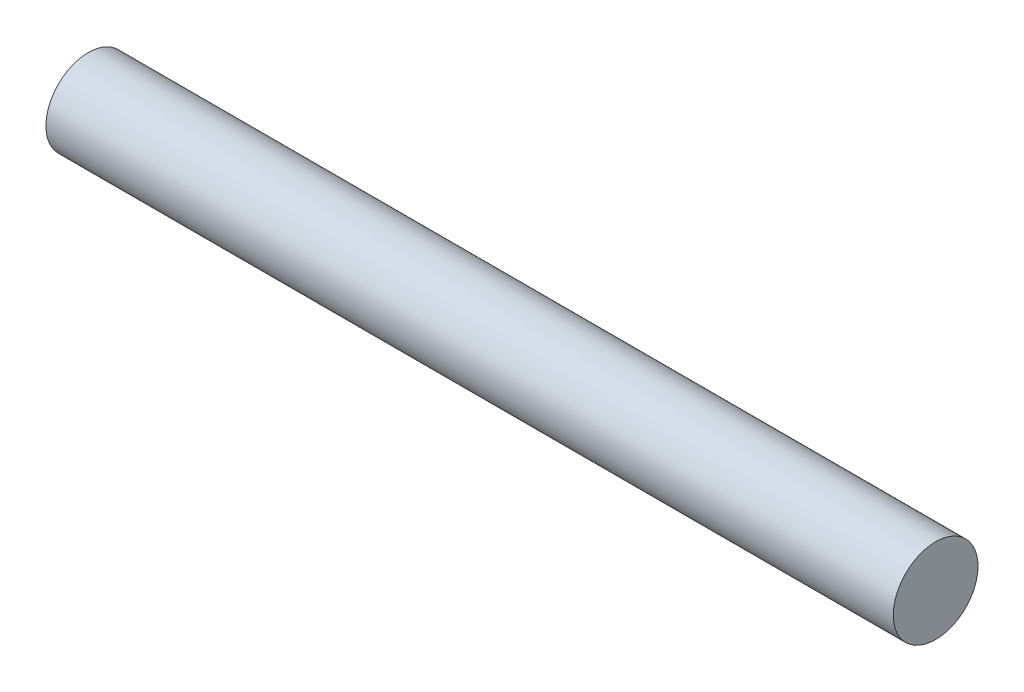
ISO-10303-21;
HEADER;
FILE_DESCRIPTION(('STEP AP214'),'2;1');
FILE_NAME('part.step','',(''),(''),'','','');
FILE_SCHEMA(('AUTOMOTIVE_DESIGN { 1 0 10303 214 1 1 1 1 }'));
ENDSEC;
DATA;
#1=APPLICATION_CONTEXT('core data for automotive mechanical design processes');
#2=APPLICATION_PROTOCOL_DEFINITION('international standard','automotive_design',2000,#1);
#3=PRODUCT_CONTEXT('',#1,'mechanical');
#4=PRODUCT('Part','Part','',(#3));
#5=PRODUCT_RELATED_PRODUCT_CATEGORY('part','',(#4));
#6=PRODUCT_DEFINITION_FORMATION('','',#4);
#7=PRODUCT_DEFINITION_CONTEXT('part definition',#1,'design');
#8=PRODUCT_DEFINITION('design','',#6,#7);
#9=PRODUCT_DEFINITION_SHAPE('','',#8);
#10=(LENGTH_UNIT() NAMED_UNIT(*) SI_UNIT(.MILLI.,.METRE.));
#11=(NAMED_UNIT(*) PLANE_ANGLE_UNIT() SI_UNIT($,.RADIAN.));
#12=(NAMED_UNIT(*) SI_UNIT($,.STERADIAN.) SOLID_ANGLE_UNIT());
#13=UNCERTAINTY_MEASURE_WITH_UNIT(LENGTH_MEASURE(1.E-05),#10,'distance_accuracy_value','');
#14=(GEOMETRIC_REPRESENTATION_CONTEXT(3) GLOBAL_UNCERTAINTY_ASSIGNED_CONTEXT((#13)) GLOBAL_UNIT_ASSIGNED_CONTEXT((#10,
#11,#12)) REPRESENTATION_CONTEXT('',''));
#15=CARTESIAN_POINT('',(0.,0.,0.));
#16=DIRECTION('',(0.,0.,1.));
#17=DIRECTION('',(1.,0.,0.));
#18=AXIS2_PLACEMENT_3D('',#15,#16,#17);
#19=CARTESIAN_POINT('',(7.62,0.,0.));
#20=DIRECTION('',(-1.,0.,0.));
#21=DIRECTION('',(0.,0.,1.));
#22=AXIS2_PLACEMENT_3D('',#19,#20,#21);
#23=CYLINDRICAL_SURFACE('',#22,0.381);
#24=CARTESIAN_POINT('',(7.62,0.,0.));
#25=DIRECTION('',(1.,0.,0.));
#26=DIRECTION('',(0.,0.,-1.));
#27=AXIS2_PLACEMENT_3D('',#24,#25,#26);
#28=CIRCLE('',#27,0.381);
#29=CARTESIAN_POINT('',(7.62,0.,-0.381));
#30=VERTEX_POINT('',#29);
#31=EDGE_CURVE('E10',#30,#30,#28,.T.);
#32=ORIENTED_EDGE('',*,*,#31,.F.);
#33=EDGE_LOOP('',(#32));
#34=FACE_BOUND('',#33,.T.);
#35=CARTESIAN_POINT('',(0.,0.,0.));
#36=DIRECTION('',(1.,0.,0.));
#37=DIRECTION('',(0.,0.,-1.));
#38=AXIS2_PLACEMENT_3D('',#35,#36,#37);
#39=CIRCLE('',#38,0.381);
#40=CARTESIAN_POINT('',(0.,0.,-0.381));
#41=VERTEX_POINT('',#40);
#42=EDGE_CURVE('E34',#41,#41,#39,.T.);
#43=ORIENTED_EDGE('',*,*,#42,.T.);
#44=EDGE_LOOP('',(#43));
#45=FACE_BOUND('',#44,.T.);
#46=ADVANCED_FACE('F31',(#34,#45),#23,.T.);
#47=CARTESIAN_POINT('',(7.62,0.,0.));
#48=DIRECTION('',(1.,0.,0.));
#49=DIRECTION('',(0.,0.,-1.));
#50=AXIS2_PLACEMENT_3D('',#47,#48,#49);
#51=PLANE('',#50);
#52=ORIENTED_EDGE('',*,*,#31,.T.);
#53=EDGE_LOOP('',(#52));
#54=FACE_BOUND('',#53,.T.);
#55=ADVANCED_FACE('F46',(#54),#51,.T.);
#56=CARTESIAN_POINT('',(0.,0.,0.));
#57=DIRECTION('',(1.,0.,0.));
#58=DIRECTION('',(0.,0.,-1.));
#59=AXIS2_PLACEMENT_3D('',#56,#57,#58);
#60=PLANE('',#59);
#61=ORIENTED_EDGE('',*,*,#42,.F.);
#62=EDGE_LOOP('',(#61));
#63=FACE_BOUND('',#62,.T.);
#64=ADVANCED_FACE('F44',(#63),#60,.F.);
#65=CLOSED_SHELL('',(#46,#55,#64));
#66=MANIFOLD_SOLID_BREP('B2',#65);
#67=ADVANCED_BREP_SHAPE_REPRESENTATION('',(#18,#66),#14);
#68=SHAPE_DEFINITION_REPRESENTATION(#9,#67);
ENDSEC;
END-ISO-10303-21;
